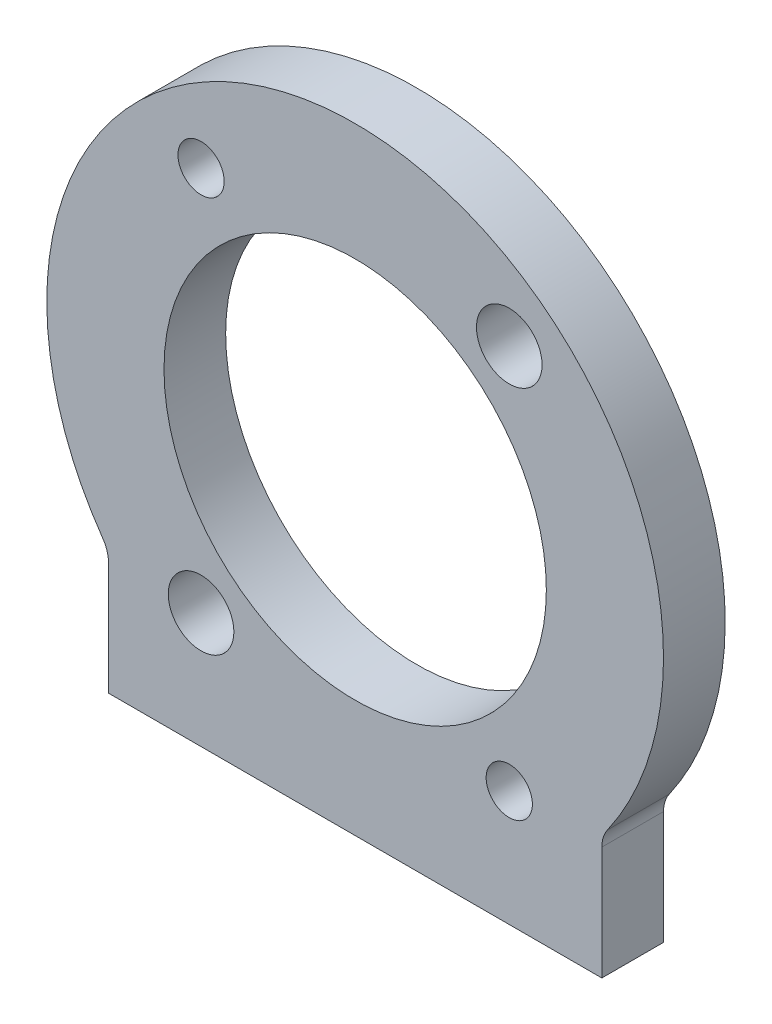
ISO-10303-21;
HEADER;
FILE_DESCRIPTION(('STEP AP214'),'2;1');
FILE_NAME('part.step','',(''),(''),'','','');
FILE_SCHEMA(('AUTOMOTIVE_DESIGN { 1 0 10303 214 1 1 1 1 }'));
ENDSEC;
DATA;
#1=APPLICATION_CONTEXT('core data for automotive mechanical design processes');
#2=APPLICATION_PROTOCOL_DEFINITION('international standard','automotive_design',2000,#1);
#3=PRODUCT_CONTEXT('',#1,'mechanical');
#4=PRODUCT('Part','Part','',(#3));
#5=PRODUCT_RELATED_PRODUCT_CATEGORY('part','',(#4));
#6=PRODUCT_DEFINITION_FORMATION('','',#4);
#7=PRODUCT_DEFINITION_CONTEXT('part definition',#1,'design');
#8=PRODUCT_DEFINITION('design','',#6,#7);
#9=PRODUCT_DEFINITION_SHAPE('','',#8);
#10=(LENGTH_UNIT() NAMED_UNIT(*) SI_UNIT(.MILLI.,.METRE.));
#11=(NAMED_UNIT(*) PLANE_ANGLE_UNIT() SI_UNIT($,.RADIAN.));
#12=(NAMED_UNIT(*) SI_UNIT($,.STERADIAN.) SOLID_ANGLE_UNIT());
#13=UNCERTAINTY_MEASURE_WITH_UNIT(LENGTH_MEASURE(1.E-05),#10,'distance_accuracy_value','');
#14=(GEOMETRIC_REPRESENTATION_CONTEXT(3) GLOBAL_UNCERTAINTY_ASSIGNED_CONTEXT((#13)) GLOBAL_UNIT_ASSIGNED_CONTEXT((#10,
#11,#12)) REPRESENTATION_CONTEXT('',''));
#15=CARTESIAN_POINT('',(0.,0.,0.));
#16=DIRECTION('',(0.,0.,1.));
#17=DIRECTION('',(1.,0.,0.));
#18=AXIS2_PLACEMENT_3D('',#15,#16,#17);
#19=CARTESIAN_POINT('',(3.175,11.6695368579308,6.35));
#20=DIRECTION('',(0.,0.,-1.));
#21=DIRECTION('',(-1.,0.,0.));
#22=AXIS2_PLACEMENT_3D('',#19,#20,#21);
#23=PLANE('',#22);
#24=DIRECTION('',(0.,1.,0.));
#25=VECTOR('',#24,1.);
#26=CARTESIAN_POINT('',(0.,0.,6.35));
#27=LINE('',#26,#25);
#28=CARTESIAN_POINT('',(0.,0.,6.35));
#29=VERTEX_POINT('',#28);
#30=CARTESIAN_POINT('',(0.,11.6695368579308,6.35));
#31=VERTEX_POINT('',#30);
#32=EDGE_CURVE('E135',#29,#31,#27,.T.);
#33=ORIENTED_EDGE('',*,*,#32,.T.);
#34=CARTESIAN_POINT('',(3.175,11.6695368579308,6.35));
#35=DIRECTION('',(0.,0.,-1.));
#36=DIRECTION('',(-1.,0.,0.));
#37=AXIS2_PLACEMENT_3D('',#34,#35,#36);
#38=CIRCLE('',#37,3.175);
#39=CARTESIAN_POINT('',(0.577272727272735,13.4950335072098,6.35));
#40=VERTEX_POINT('',#39);
#41=EDGE_CURVE('E93',#31,#40,#38,.T.);
#42=ORIENTED_EDGE('',*,*,#41,.T.);
#43=CARTESIAN_POINT('',(-25.4,31.75,6.35));
#44=DIRECTION('',(0.,0.,1.));
#45=DIRECTION('',(1.,0.,0.));
#46=AXIS2_PLACEMENT_3D('',#43,#44,#45);
#47=CIRCLE('',#46,31.75);
#48=CARTESIAN_POINT('',(-51.3772727272727,13.4950335072098,6.35));
#49=VERTEX_POINT('',#48);
#50=EDGE_CURVE('E106',#40,#49,#47,.T.);
#51=ORIENTED_EDGE('',*,*,#50,.T.);
#52=CARTESIAN_POINT('',(-53.975,11.6695368579308,6.35));
#53=DIRECTION('',(0.,0.,-1.));
#54=DIRECTION('',(1.,0.,0.));
#55=AXIS2_PLACEMENT_3D('',#52,#53,#54);
#56=CIRCLE('',#55,3.17499999999999);
#57=CARTESIAN_POINT('',(-50.8,11.6695368579308,6.35));
#58=VERTEX_POINT('',#57);
#59=EDGE_CURVE('E100',#49,#58,#56,.T.);
#60=ORIENTED_EDGE('',*,*,#59,.T.);
#61=DIRECTION('',(0.,-1.,0.));
#62=VECTOR('',#61,1.);
#63=CARTESIAN_POINT('',(-50.8,0.,6.35));
#64=LINE('',#63,#62);
#65=CARTESIAN_POINT('',(-50.8,0.,6.35));
#66=VERTEX_POINT('',#65);
#67=EDGE_CURVE('E104',#58,#66,#64,.T.);
#68=ORIENTED_EDGE('',*,*,#67,.T.);
#69=DIRECTION('',(1.,0.,0.));
#70=VECTOR('',#69,1.);
#71=CARTESIAN_POINT('',(0.,0.,6.35));
#72=LINE('',#71,#70);
#73=EDGE_CURVE('E56',#66,#29,#72,.T.);
#74=ORIENTED_EDGE('',*,*,#73,.T.);
#75=EDGE_LOOP('',(#33,#42,#51,#60,#68,#74));
#76=FACE_BOUND('',#75,.T.);
#77=CARTESIAN_POINT('',(-25.4,31.75,6.35));
#78=DIRECTION('',(0.,0.,1.));
#79=DIRECTION('',(1.,0.,0.));
#80=AXIS2_PLACEMENT_3D('',#77,#78,#79);
#81=CIRCLE('',#80,19.685);
#82=CARTESIAN_POINT('',(-5.715,31.75,6.35));
#83=VERTEX_POINT('',#82);
#84=EDGE_CURVE('E128',#83,#83,#81,.T.);
#85=ORIENTED_EDGE('',*,*,#84,.F.);
#86=EDGE_LOOP('',(#85));
#87=FACE_BOUND('',#86,.T.);
#88=CARTESIAN_POINT('',(-41.2672542078824,51.584067759853,6.35));
#89=DIRECTION('',(0.,0.,1.));
#90=DIRECTION('',(1.,0.,0.));
#91=AXIS2_PLACEMENT_3D('',#88,#89,#90);
#92=CIRCLE('',#91,2.38125);
#93=CARTESIAN_POINT('',(-38.8860042078824,51.584067759853,6.35));
#94=VERTEX_POINT('',#93);
#95=EDGE_CURVE('E209',#94,#94,#92,.T.);
#96=ORIENTED_EDGE('',*,*,#95,.F.);
#97=EDGE_LOOP('',(#96));
#98=FACE_BOUND('',#97,.T.);
#99=CARTESIAN_POINT('',(-9.53274579211763,51.584067759853,6.35));
#100=DIRECTION('',(0.,0.,1.));
#101=DIRECTION('',(1.,0.,0.));
#102=AXIS2_PLACEMENT_3D('',#99,#100,#101);
#103=CIRCLE('',#102,3.3782);
#104=CARTESIAN_POINT('',(-6.15454579211763,51.584067759853,6.35));
#105=VERTEX_POINT('',#104);
#106=EDGE_CURVE('E203',#105,#105,#103,.T.);
#107=ORIENTED_EDGE('',*,*,#106,.F.);
#108=EDGE_LOOP('',(#107));
#109=FACE_BOUND('',#108,.T.);
#110=CARTESIAN_POINT('',(-9.53274579211762,11.915932240147,6.35));
#111=DIRECTION('',(0.,0.,1.));
#112=DIRECTION('',(1.,0.,0.));
#113=AXIS2_PLACEMENT_3D('',#110,#111,#112);
#114=CIRCLE('',#113,2.38125);
#115=CARTESIAN_POINT('',(-7.15149579211762,11.915932240147,6.35));
#116=VERTEX_POINT('',#115);
#117=EDGE_CURVE('E197',#116,#116,#114,.T.);
#118=ORIENTED_EDGE('',*,*,#117,.F.);
#119=EDGE_LOOP('',(#118));
#120=FACE_BOUND('',#119,.T.);
#121=CARTESIAN_POINT('',(-41.2672542078824,11.915932240147,6.35));
#122=DIRECTION('',(0.,0.,1.));
#123=DIRECTION('',(1.,0.,0.));
#124=AXIS2_PLACEMENT_3D('',#121,#122,#123);
#125=CIRCLE('',#124,3.3782);
#126=CARTESIAN_POINT('',(-37.8890542078824,11.915932240147,6.35));
#127=VERTEX_POINT('',#126);
#128=EDGE_CURVE('E188',#127,#127,#125,.T.);
#129=ORIENTED_EDGE('',*,*,#128,.F.);
#130=EDGE_LOOP('',(#129));
#131=FACE_BOUND('',#130,.T.);
#132=ADVANCED_FACE('F39',(#76,#87,#98,#109,#120,#131),#23,.F.);
#133=CARTESIAN_POINT('',(3.175,11.6695368579308,0.));
#134=DIRECTION('',(0.,0.,-1.));
#135=DIRECTION('',(-1.,0.,0.));
#136=AXIS2_PLACEMENT_3D('',#133,#134,#135);
#137=PLANE('',#136);
#138=CARTESIAN_POINT('',(-9.53274579211762,11.915932240147,0.));
#139=DIRECTION('',(0.,0.,1.));
#140=DIRECTION('',(1.,0.,0.));
#141=AXIS2_PLACEMENT_3D('',#138,#139,#140);
#142=CIRCLE('',#141,2.38125);
#143=CARTESIAN_POINT('',(-7.15149579211762,11.915932240147,0.));
#144=VERTEX_POINT('',#143);
#145=EDGE_CURVE('E194',#144,#144,#142,.T.);
#146=ORIENTED_EDGE('',*,*,#145,.T.);
#147=EDGE_LOOP('',(#146));
#148=FACE_BOUND('',#147,.T.);
#149=CARTESIAN_POINT('',(-41.2672542078824,51.584067759853,0.));
#150=DIRECTION('',(0.,0.,1.));
#151=DIRECTION('',(1.,0.,0.));
#152=AXIS2_PLACEMENT_3D('',#149,#150,#151);
#153=CIRCLE('',#152,2.38125);
#154=CARTESIAN_POINT('',(-38.8860042078824,51.584067759853,0.));
#155=VERTEX_POINT('',#154);
#156=EDGE_CURVE('E206',#155,#155,#153,.T.);
#157=ORIENTED_EDGE('',*,*,#156,.T.);
#158=EDGE_LOOP('',(#157));
#159=FACE_BOUND('',#158,.T.);
#160=DIRECTION('',(0.,1.,0.));
#161=VECTOR('',#160,1.);
#162=CARTESIAN_POINT('',(0.,0.,0.));
#163=LINE('',#162,#161);
#164=CARTESIAN_POINT('',(0.,0.,0.));
#165=VERTEX_POINT('',#164);
#166=CARTESIAN_POINT('',(0.,11.6695368579308,0.));
#167=VERTEX_POINT('',#166);
#168=EDGE_CURVE('E124',#165,#167,#163,.T.);
#169=ORIENTED_EDGE('',*,*,#168,.F.);
#170=DIRECTION('',(1.,0.,0.));
#171=VECTOR('',#170,1.);
#172=CARTESIAN_POINT('',(0.,0.,0.));
#173=LINE('',#172,#171);
#174=CARTESIAN_POINT('',(-50.8,0.,0.));
#175=VERTEX_POINT('',#174);
#176=EDGE_CURVE('E85',#175,#165,#173,.T.);
#177=ORIENTED_EDGE('',*,*,#176,.F.);
#178=DIRECTION('',(0.,-1.,0.));
#179=VECTOR('',#178,1.);
#180=CARTESIAN_POINT('',(-50.8,0.,0.));
#181=LINE('',#180,#179);
#182=CARTESIAN_POINT('',(-50.8,11.6695368579308,0.));
#183=VERTEX_POINT('',#182);
#184=EDGE_CURVE('E79',#183,#175,#181,.T.);
#185=ORIENTED_EDGE('',*,*,#184,.F.);
#186=CARTESIAN_POINT('',(-53.975,11.6695368579308,0.));
#187=DIRECTION('',(0.,0.,-1.));
#188=DIRECTION('',(1.,0.,0.));
#189=AXIS2_PLACEMENT_3D('',#186,#187,#188);
#190=CIRCLE('',#189,3.17499999999999);
#191=CARTESIAN_POINT('',(-51.3772727272727,13.4950335072098,0.));
#192=VERTEX_POINT('',#191);
#193=EDGE_CURVE('E114',#192,#183,#190,.T.);
#194=ORIENTED_EDGE('',*,*,#193,.F.);
#195=CARTESIAN_POINT('',(-25.4,31.75,0.));
#196=DIRECTION('',(0.,0.,1.));
#197=DIRECTION('',(1.,0.,0.));
#198=AXIS2_PLACEMENT_3D('',#195,#196,#197);
#199=CIRCLE('',#198,31.75);
#200=CARTESIAN_POINT('',(0.577272727272735,13.4950335072098,0.));
#201=VERTEX_POINT('',#200);
#202=EDGE_CURVE('E130',#201,#192,#199,.T.);
#203=ORIENTED_EDGE('',*,*,#202,.F.);
#204=CARTESIAN_POINT('',(3.175,11.6695368579308,0.));
#205=DIRECTION('',(0.,0.,-1.));
#206=DIRECTION('',(-1.,0.,0.));
#207=AXIS2_PLACEMENT_3D('',#204,#205,#206);
#208=CIRCLE('',#207,3.175);
#209=EDGE_CURVE('E127',#167,#201,#208,.T.);
#210=ORIENTED_EDGE('',*,*,#209,.F.);
#211=EDGE_LOOP('',(#169,#177,#185,#194,#203,#210));
#212=FACE_BOUND('',#211,.T.);
#213=CARTESIAN_POINT('',(-25.4,31.75,0.));
#214=DIRECTION('',(0.,0.,1.));
#215=DIRECTION('',(1.,0.,0.));
#216=AXIS2_PLACEMENT_3D('',#213,#214,#215);
#217=CIRCLE('',#216,19.685);
#218=CARTESIAN_POINT('',(-5.715,31.75,0.));
#219=VERTEX_POINT('',#218);
#220=EDGE_CURVE('E212',#219,#219,#217,.T.);
#221=ORIENTED_EDGE('',*,*,#220,.T.);
#222=EDGE_LOOP('',(#221));
#223=FACE_BOUND('',#222,.T.);
#224=CARTESIAN_POINT('',(-9.53274579211763,51.584067759853,0.));
#225=DIRECTION('',(0.,0.,1.));
#226=DIRECTION('',(1.,0.,0.));
#227=AXIS2_PLACEMENT_3D('',#224,#225,#226);
#228=CIRCLE('',#227,3.3782);
#229=CARTESIAN_POINT('',(-6.15454579211763,51.584067759853,0.));
#230=VERTEX_POINT('',#229);
#231=EDGE_CURVE('E200',#230,#230,#228,.T.);
#232=ORIENTED_EDGE('',*,*,#231,.T.);
#233=EDGE_LOOP('',(#232));
#234=FACE_BOUND('',#233,.T.);
#235=CARTESIAN_POINT('',(-41.2672542078824,11.915932240147,0.));
#236=DIRECTION('',(0.,0.,1.));
#237=DIRECTION('',(1.,0.,0.));
#238=AXIS2_PLACEMENT_3D('',#235,#236,#237);
#239=CIRCLE('',#238,3.3782);
#240=CARTESIAN_POINT('',(-37.8890542078824,11.915932240147,0.));
#241=VERTEX_POINT('',#240);
#242=EDGE_CURVE('E191',#241,#241,#239,.T.);
#243=ORIENTED_EDGE('',*,*,#242,.T.);
#244=EDGE_LOOP('',(#243));
#245=FACE_BOUND('',#244,.T.);
#246=ADVANCED_FACE('F144',(#148,#159,#212,#223,#234,#245),#137,.T.);
#247=CARTESIAN_POINT('',(0.,0.,6.35));
#248=DIRECTION('',(-1.,0.,0.));
#249=DIRECTION('',(0.,0.,1.));
#250=AXIS2_PLACEMENT_3D('',#247,#248,#249);
#251=PLANE('',#250);
#252=ORIENTED_EDGE('',*,*,#168,.T.);
#253=DIRECTION('',(0.,0.,-1.));
#254=VECTOR('',#253,1.);
#255=CARTESIAN_POINT('',(0.,11.6695368579308,6.35));
#256=LINE('',#255,#254);
#257=EDGE_CURVE('E11',#31,#167,#256,.T.);
#258=ORIENTED_EDGE('',*,*,#257,.F.);
#259=ORIENTED_EDGE('',*,*,#32,.F.);
#260=DIRECTION('',(0.,0.,-1.));
#261=VECTOR('',#260,1.);
#262=CARTESIAN_POINT('',(0.,0.,6.35));
#263=LINE('',#262,#261);
#264=EDGE_CURVE('E120',#29,#165,#263,.T.);
#265=ORIENTED_EDGE('',*,*,#264,.T.);
#266=EDGE_LOOP('',(#252,#258,#259,#265));
#267=FACE_BOUND('',#266,.T.);
#268=ADVANCED_FACE('F41',(#267),#251,.F.);
#269=CARTESIAN_POINT('',(3.175,11.6695368579308,6.35));
#270=DIRECTION('',(0.,0.,-1.));
#271=DIRECTION('',(-1.,0.,0.));
#272=AXIS2_PLACEMENT_3D('',#269,#270,#271);
#273=CYLINDRICAL_SURFACE('',#272,3.175);
#274=ORIENTED_EDGE('',*,*,#209,.T.);
#275=DIRECTION('',(0.,0.,-1.));
#276=VECTOR('',#275,1.);
#277=CARTESIAN_POINT('',(0.577272727272735,13.4950335072098,6.35));
#278=LINE('',#277,#276);
#279=EDGE_CURVE('E48',#40,#201,#278,.T.);
#280=ORIENTED_EDGE('',*,*,#279,.F.);
#281=ORIENTED_EDGE('',*,*,#41,.F.);
#282=ORIENTED_EDGE('',*,*,#257,.T.);
#283=EDGE_LOOP('',(#274,#280,#281,#282));
#284=FACE_BOUND('',#283,.T.);
#285=ADVANCED_FACE('F285',(#284),#273,.F.);
#286=CARTESIAN_POINT('',(-25.4,31.75,6.35));
#287=DIRECTION('',(0.,0.,-1.));
#288=DIRECTION('',(-1.,0.,0.));
#289=AXIS2_PLACEMENT_3D('',#286,#287,#288);
#290=CYLINDRICAL_SURFACE('',#289,31.75);
#291=ORIENTED_EDGE('',*,*,#202,.T.);
#292=DIRECTION('',(0.,0.,-1.));
#293=VECTOR('',#292,1.);
#294=CARTESIAN_POINT('',(-51.3772727272727,13.4950335072098,6.35));
#295=LINE('',#294,#293);
#296=EDGE_CURVE('E115',#49,#192,#295,.T.);
#297=ORIENTED_EDGE('',*,*,#296,.F.);
#298=ORIENTED_EDGE('',*,*,#50,.F.);
#299=ORIENTED_EDGE('',*,*,#279,.T.);
#300=EDGE_LOOP('',(#291,#297,#298,#299));
#301=FACE_BOUND('',#300,.T.);
#302=ADVANCED_FACE('F141',(#301),#290,.T.);
#303=CARTESIAN_POINT('',(-53.975,11.6695368579308,6.35));
#304=DIRECTION('',(0.,0.,-1.));
#305=DIRECTION('',(-1.,0.,0.));
#306=AXIS2_PLACEMENT_3D('',#303,#304,#305);
#307=CYLINDRICAL_SURFACE('',#306,3.17499999999999);
#308=ORIENTED_EDGE('',*,*,#193,.T.);
#309=DIRECTION('',(0.,0.,-1.));
#310=VECTOR('',#309,1.);
#311=CARTESIAN_POINT('',(-50.8,11.6695368579308,6.35));
#312=LINE('',#311,#310);
#313=EDGE_CURVE('E111',#58,#183,#312,.T.);
#314=ORIENTED_EDGE('',*,*,#313,.F.);
#315=ORIENTED_EDGE('',*,*,#59,.F.);
#316=ORIENTED_EDGE('',*,*,#296,.T.);
#317=EDGE_LOOP('',(#308,#314,#315,#316));
#318=FACE_BOUND('',#317,.T.);
#319=ADVANCED_FACE('F112',(#318),#307,.F.);
#320=CARTESIAN_POINT('',(-50.8,0.,6.35));
#321=DIRECTION('',(1.,0.,0.));
#322=DIRECTION('',(0.,0.,-1.));
#323=AXIS2_PLACEMENT_3D('',#320,#321,#322);
#324=PLANE('',#323);
#325=ORIENTED_EDGE('',*,*,#184,.T.);
#326=DIRECTION('',(0.,0.,-1.));
#327=VECTOR('',#326,1.);
#328=CARTESIAN_POINT('',(-50.8,0.,6.35));
#329=LINE('',#328,#327);
#330=EDGE_CURVE('E116',#66,#175,#329,.T.);
#331=ORIENTED_EDGE('',*,*,#330,.F.);
#332=ORIENTED_EDGE('',*,*,#67,.F.);
#333=ORIENTED_EDGE('',*,*,#313,.T.);
#334=EDGE_LOOP('',(#325,#331,#332,#333));
#335=FACE_BOUND('',#334,.T.);
#336=ADVANCED_FACE('F118',(#335),#324,.F.);
#337=CARTESIAN_POINT('',(0.,0.,6.35));
#338=DIRECTION('',(0.,1.,0.));
#339=DIRECTION('',(0.,0.,1.));
#340=AXIS2_PLACEMENT_3D('',#337,#338,#339);
#341=PLANE('',#340);
#342=ORIENTED_EDGE('',*,*,#176,.T.);
#343=ORIENTED_EDGE('',*,*,#264,.F.);
#344=ORIENTED_EDGE('',*,*,#73,.F.);
#345=ORIENTED_EDGE('',*,*,#330,.T.);
#346=EDGE_LOOP('',(#342,#343,#344,#345));
#347=FACE_BOUND('',#346,.T.);
#348=ADVANCED_FACE('F149',(#347),#341,.F.);
#349=CARTESIAN_POINT('',(-25.4,31.75,6.35));
#350=DIRECTION('',(0.,0.,-1.));
#351=DIRECTION('',(-1.,0.,0.));
#352=AXIS2_PLACEMENT_3D('',#349,#350,#351);
#353=CYLINDRICAL_SURFACE('',#352,19.685);
#354=ORIENTED_EDGE('',*,*,#84,.T.);
#355=EDGE_LOOP('',(#354));
#356=FACE_BOUND('',#355,.T.);
#357=ORIENTED_EDGE('',*,*,#220,.F.);
#358=EDGE_LOOP('',(#357));
#359=FACE_BOUND('',#358,.T.);
#360=ADVANCED_FACE('F151',(#356,#359),#353,.F.);
#361=CARTESIAN_POINT('',(-41.2672542078824,51.584067759853,6.35));
#362=DIRECTION('',(0.,0.,-1.));
#363=DIRECTION('',(-1.,0.,0.));
#364=AXIS2_PLACEMENT_3D('',#361,#362,#363);
#365=CYLINDRICAL_SURFACE('',#364,2.38125);
#366=ORIENTED_EDGE('',*,*,#95,.T.);
#367=EDGE_LOOP('',(#366));
#368=FACE_BOUND('',#367,.T.);
#369=ORIENTED_EDGE('',*,*,#156,.F.);
#370=EDGE_LOOP('',(#369));
#371=FACE_BOUND('',#370,.T.);
#372=ADVANCED_FACE('F157',(#368,#371),#365,.F.);
#373=CARTESIAN_POINT('',(-9.53274579211763,51.584067759853,6.35));
#374=DIRECTION('',(0.,0.,-1.));
#375=DIRECTION('',(-1.,0.,0.));
#376=AXIS2_PLACEMENT_3D('',#373,#374,#375);
#377=CYLINDRICAL_SURFACE('',#376,3.3782);
#378=ORIENTED_EDGE('',*,*,#106,.T.);
#379=EDGE_LOOP('',(#378));
#380=FACE_BOUND('',#379,.T.);
#381=ORIENTED_EDGE('',*,*,#231,.F.);
#382=EDGE_LOOP('',(#381));
#383=FACE_BOUND('',#382,.T.);
#384=ADVANCED_FACE('F171',(#380,#383),#377,.F.);
#385=CARTESIAN_POINT('',(-9.53274579211762,11.915932240147,6.35));
#386=DIRECTION('',(0.,0.,-1.));
#387=DIRECTION('',(-1.,0.,0.));
#388=AXIS2_PLACEMENT_3D('',#385,#386,#387);
#389=CYLINDRICAL_SURFACE('',#388,2.38125);
#390=ORIENTED_EDGE('',*,*,#117,.T.);
#391=EDGE_LOOP('',(#390));
#392=FACE_BOUND('',#391,.T.);
#393=ORIENTED_EDGE('',*,*,#145,.F.);
#394=EDGE_LOOP('',(#393));
#395=FACE_BOUND('',#394,.T.);
#396=ADVANCED_FACE('F175',(#392,#395),#389,.F.);
#397=CARTESIAN_POINT('',(-41.2672542078824,11.915932240147,6.35));
#398=DIRECTION('',(0.,0.,-1.));
#399=DIRECTION('',(-1.,0.,0.));
#400=AXIS2_PLACEMENT_3D('',#397,#398,#399);
#401=CYLINDRICAL_SURFACE('',#400,3.3782);
#402=ORIENTED_EDGE('',*,*,#128,.T.);
#403=EDGE_LOOP('',(#402));
#404=FACE_BOUND('',#403,.T.);
#405=ORIENTED_EDGE('',*,*,#242,.F.);
#406=EDGE_LOOP('',(#405));
#407=FACE_BOUND('',#406,.T.);
#408=ADVANCED_FACE('F179',(#404,#407),#401,.F.);
#409=CLOSED_SHELL('',(#132,#246,#268,#285,#302,#319,#336,#348,#360,#372,#384,#396,#408));
#410=MANIFOLD_SOLID_BREP('B2',#409);
#411=ADVANCED_BREP_SHAPE_REPRESENTATION('',(#18,#410),#14);
#412=SHAPE_DEFINITION_REPRESENTATION(#9,#411);
ENDSEC;
END-ISO-10303-21;
